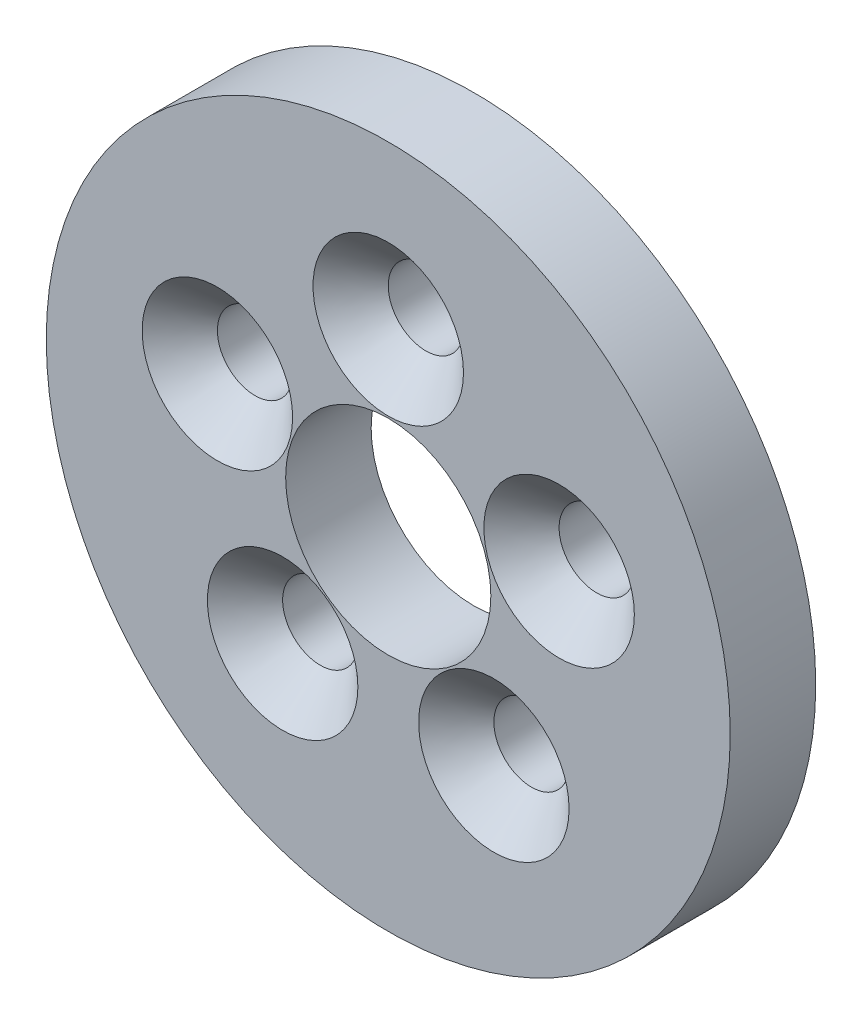
ISO-10303-21;
HEADER;
FILE_DESCRIPTION(('STEP AP214'),'2;1');
FILE_NAME('part.step','',(''),(''),'','','');
FILE_SCHEMA(('AUTOMOTIVE_DESIGN { 1 0 10303 214 1 1 1 1 }'));
ENDSEC;
DATA;
#1=APPLICATION_CONTEXT('core data for automotive mechanical design processes');
#2=APPLICATION_PROTOCOL_DEFINITION('international standard','automotive_design',2000,#1);
#3=PRODUCT_CONTEXT('',#1,'mechanical');
#4=PRODUCT('Part','Part','',(#3));
#5=PRODUCT_RELATED_PRODUCT_CATEGORY('part','',(#4));
#6=PRODUCT_DEFINITION_FORMATION('','',#4);
#7=PRODUCT_DEFINITION_CONTEXT('part definition',#1,'design');
#8=PRODUCT_DEFINITION('design','',#6,#7);
#9=PRODUCT_DEFINITION_SHAPE('','',#8);
#10=(LENGTH_UNIT() NAMED_UNIT(*) SI_UNIT(.MILLI.,.METRE.));
#11=(NAMED_UNIT(*) PLANE_ANGLE_UNIT() SI_UNIT($,.RADIAN.));
#12=(NAMED_UNIT(*) SI_UNIT($,.STERADIAN.) SOLID_ANGLE_UNIT());
#13=UNCERTAINTY_MEASURE_WITH_UNIT(LENGTH_MEASURE(1.E-05),#10,'distance_accuracy_value','');
#14=(GEOMETRIC_REPRESENTATION_CONTEXT(3) GLOBAL_UNCERTAINTY_ASSIGNED_CONTEXT((#13)) GLOBAL_UNIT_ASSIGNED_CONTEXT((#10,
#11,#12)) REPRESENTATION_CONTEXT('',''));
#15=CARTESIAN_POINT('',(0.,0.,0.));
#16=DIRECTION('',(0.,0.,1.));
#17=DIRECTION('',(1.,0.,0.));
#18=AXIS2_PLACEMENT_3D('',#15,#16,#17);
#19=CARTESIAN_POINT('',(0.,0.,2.5));
#20=DIRECTION('',(0.,0.,-1.));
#21=DIRECTION('',(-1.,0.,0.));
#22=AXIS2_PLACEMENT_3D('',#19,#20,#21);
#23=CYLINDRICAL_SURFACE('',#22,10.);
#24=CARTESIAN_POINT('',(0.,0.,2.5));
#25=DIRECTION('',(0.,0.,1.));
#26=DIRECTION('',(1.,0.,0.));
#27=AXIS2_PLACEMENT_3D('',#24,#25,#26);
#28=CIRCLE('',#27,10.);
#29=CARTESIAN_POINT('',(10.,0.,2.5));
#30=VERTEX_POINT('',#29);
#31=EDGE_CURVE('E44',#30,#30,#28,.T.);
#32=ORIENTED_EDGE('',*,*,#31,.F.);
#33=EDGE_LOOP('',(#32));
#34=FACE_BOUND('',#33,.T.);
#35=CARTESIAN_POINT('',(0.,0.,0.));
#36=DIRECTION('',(0.,0.,1.));
#37=DIRECTION('',(1.,0.,0.));
#38=AXIS2_PLACEMENT_3D('',#35,#36,#37);
#39=CIRCLE('',#38,10.);
#40=CARTESIAN_POINT('',(10.,0.,0.));
#41=VERTEX_POINT('',#40);
#42=EDGE_CURVE('E51',#41,#41,#39,.T.);
#43=ORIENTED_EDGE('',*,*,#42,.T.);
#44=EDGE_LOOP('',(#43));
#45=FACE_BOUND('',#44,.T.);
#46=ADVANCED_FACE('F37',(#34,#45),#23,.T.);
#47=CARTESIAN_POINT('',(0.,0.,2.5));
#48=DIRECTION('',(0.,0.,-1.));
#49=DIRECTION('',(-1.,0.,0.));
#50=AXIS2_PLACEMENT_3D('',#47,#48,#49);
#51=CYLINDRICAL_SURFACE('',#50,3.);
#52=CARTESIAN_POINT('',(0.,0.,2.5));
#53=DIRECTION('',(0.,0.,1.));
#54=DIRECTION('',(1.,0.,0.));
#55=AXIS2_PLACEMENT_3D('',#52,#53,#54);
#56=CIRCLE('',#55,3.);
#57=CARTESIAN_POINT('',(3.,0.,2.5));
#58=VERTEX_POINT('',#57);
#59=EDGE_CURVE('E10',#58,#58,#56,.T.);
#60=ORIENTED_EDGE('',*,*,#59,.T.);
#61=EDGE_LOOP('',(#60));
#62=FACE_BOUND('',#61,.T.);
#63=CARTESIAN_POINT('',(0.,0.,0.));
#64=DIRECTION('',(0.,0.,1.));
#65=DIRECTION('',(1.,0.,0.));
#66=AXIS2_PLACEMENT_3D('',#63,#64,#65);
#67=CIRCLE('',#66,3.);
#68=CARTESIAN_POINT('',(3.,0.,0.));
#69=VERTEX_POINT('',#68);
#70=EDGE_CURVE('E40',#69,#69,#67,.T.);
#71=ORIENTED_EDGE('',*,*,#70,.F.);
#72=EDGE_LOOP('',(#71));
#73=FACE_BOUND('',#72,.T.);
#74=ADVANCED_FACE('F110',(#62,#73),#51,.F.);
#75=CARTESIAN_POINT('',(0.,0.,2.5));
#76=DIRECTION('',(0.,0.,1.));
#77=DIRECTION('',(1.,0.,0.));
#78=AXIS2_PLACEMENT_3D('',#75,#76,#77);
#79=PLANE('',#78);
#80=CARTESIAN_POINT('',(0.,5.25328890437411,2.5));
#81=DIRECTION('',(0.,0.,1.));
#82=DIRECTION('',(1.,0.,0.));
#83=AXIS2_PLACEMENT_3D('',#80,#81,#82);
#84=CIRCLE('',#83,2.2);
#85=CARTESIAN_POINT('',(2.2,5.25328890437411,2.5));
#86=VERTEX_POINT('',#85);
#87=EDGE_CURVE('E100',#86,#86,#84,.T.);
#88=ORIENTED_EDGE('',*,*,#87,.F.);
#89=EDGE_LOOP('',(#88));
#90=FACE_BOUND('',#89,.T.);
#91=CARTESIAN_POINT('',(4.99617464448602,1.62335554781295,2.5));
#92=DIRECTION('',(0.,0.,1.));
#93=DIRECTION('',(1.,0.,0.));
#94=AXIS2_PLACEMENT_3D('',#91,#92,#93);
#95=CIRCLE('',#94,2.2);
#96=CARTESIAN_POINT('',(7.19617464448602,1.62335554781295,2.5));
#97=VERTEX_POINT('',#96);
#98=EDGE_CURVE('E91',#97,#97,#95,.T.);
#99=ORIENTED_EDGE('',*,*,#98,.F.);
#100=EDGE_LOOP('',(#99));
#101=FACE_BOUND('',#100,.T.);
#102=CARTESIAN_POINT('',(3.08780574402278,-4.25,2.5));
#103=DIRECTION('',(0.,0.,1.));
#104=DIRECTION('',(1.,0.,0.));
#105=AXIS2_PLACEMENT_3D('',#102,#103,#104);
#106=CIRCLE('',#105,2.2);
#107=CARTESIAN_POINT('',(5.28780574402278,-4.25,2.5));
#108=VERTEX_POINT('',#107);
#109=EDGE_CURVE('E82',#108,#108,#106,.T.);
#110=ORIENTED_EDGE('',*,*,#109,.F.);
#111=EDGE_LOOP('',(#110));
#112=FACE_BOUND('',#111,.T.);
#113=CARTESIAN_POINT('',(-4.99617464448602,1.62335554781295,2.5));
#114=DIRECTION('',(0.,0.,1.));
#115=DIRECTION('',(1.,0.,0.));
#116=AXIS2_PLACEMENT_3D('',#113,#114,#115);
#117=CIRCLE('',#116,2.2);
#118=CARTESIAN_POINT('',(-2.79617464448602,1.62335554781295,2.5));
#119=VERTEX_POINT('',#118);
#120=EDGE_CURVE('E73',#119,#119,#117,.T.);
#121=ORIENTED_EDGE('',*,*,#120,.F.);
#122=EDGE_LOOP('',(#121));
#123=FACE_BOUND('',#122,.T.);
#124=CARTESIAN_POINT('',(-3.08780574402278,-4.25,2.5));
#125=DIRECTION('',(0.,0.,1.));
#126=DIRECTION('',(1.,0.,0.));
#127=AXIS2_PLACEMENT_3D('',#124,#125,#126);
#128=CIRCLE('',#127,2.2);
#129=CARTESIAN_POINT('',(-0.887805744022783,-4.25,2.5));
#130=VERTEX_POINT('',#129);
#131=EDGE_CURVE('E62',#130,#130,#128,.T.);
#132=ORIENTED_EDGE('',*,*,#131,.F.);
#133=EDGE_LOOP('',(#132));
#134=FACE_BOUND('',#133,.T.);
#135=ORIENTED_EDGE('',*,*,#31,.T.);
#136=EDGE_LOOP('',(#135));
#137=FACE_BOUND('',#136,.T.);
#138=ORIENTED_EDGE('',*,*,#59,.F.);
#139=EDGE_LOOP('',(#138));
#140=FACE_BOUND('',#139,.T.);
#141=ADVANCED_FACE('F106',(#90,#101,#112,#123,#134,#137,#140),#79,.T.);
#142=CARTESIAN_POINT('',(0.,0.,0.));
#143=DIRECTION('',(0.,0.,1.));
#144=DIRECTION('',(1.,0.,0.));
#145=AXIS2_PLACEMENT_3D('',#142,#143,#144);
#146=PLANE('',#145);
#147=CARTESIAN_POINT('',(0.,5.25328890437411,0.));
#148=DIRECTION('',(0.,0.,1.));
#149=DIRECTION('',(1.,0.,0.));
#150=AXIS2_PLACEMENT_3D('',#147,#148,#149);
#151=CIRCLE('',#150,1.1);
#152=CARTESIAN_POINT('',(1.1,5.25328890437411,0.));
#153=VERTEX_POINT('',#152);
#154=EDGE_CURVE('E94',#153,#153,#151,.T.);
#155=ORIENTED_EDGE('',*,*,#154,.T.);
#156=EDGE_LOOP('',(#155));
#157=FACE_BOUND('',#156,.T.);
#158=CARTESIAN_POINT('',(4.99617464448602,1.62335554781295,0.));
#159=DIRECTION('',(0.,0.,1.));
#160=DIRECTION('',(1.,0.,0.));
#161=AXIS2_PLACEMENT_3D('',#158,#159,#160);
#162=CIRCLE('',#161,1.1);
#163=CARTESIAN_POINT('',(6.09617464448602,1.62335554781295,0.));
#164=VERTEX_POINT('',#163);
#165=EDGE_CURVE('E85',#164,#164,#162,.T.);
#166=ORIENTED_EDGE('',*,*,#165,.T.);
#167=EDGE_LOOP('',(#166));
#168=FACE_BOUND('',#167,.T.);
#169=CARTESIAN_POINT('',(3.08780574402278,-4.25,0.));
#170=DIRECTION('',(0.,0.,1.));
#171=DIRECTION('',(1.,0.,0.));
#172=AXIS2_PLACEMENT_3D('',#169,#170,#171);
#173=CIRCLE('',#172,1.1);
#174=CARTESIAN_POINT('',(4.18780574402278,-4.25,0.));
#175=VERTEX_POINT('',#174);
#176=EDGE_CURVE('E76',#175,#175,#173,.T.);
#177=ORIENTED_EDGE('',*,*,#176,.T.);
#178=EDGE_LOOP('',(#177));
#179=FACE_BOUND('',#178,.T.);
#180=CARTESIAN_POINT('',(-4.99617464448602,1.62335554781295,0.));
#181=DIRECTION('',(0.,0.,1.));
#182=DIRECTION('',(1.,0.,0.));
#183=AXIS2_PLACEMENT_3D('',#180,#181,#182);
#184=CIRCLE('',#183,1.1);
#185=CARTESIAN_POINT('',(-3.89617464448602,1.62335554781295,0.));
#186=VERTEX_POINT('',#185);
#187=EDGE_CURVE('E67',#186,#186,#184,.T.);
#188=ORIENTED_EDGE('',*,*,#187,.T.);
#189=EDGE_LOOP('',(#188));
#190=FACE_BOUND('',#189,.T.);
#191=CARTESIAN_POINT('',(-3.08780574402278,-4.25,0.));
#192=DIRECTION('',(0.,0.,1.));
#193=DIRECTION('',(1.,0.,0.));
#194=AXIS2_PLACEMENT_3D('',#191,#192,#193);
#195=CIRCLE('',#194,1.1);
#196=CARTESIAN_POINT('',(-1.98780574402278,-4.25,0.));
#197=VERTEX_POINT('',#196);
#198=EDGE_CURVE('E53',#197,#197,#195,.T.);
#199=ORIENTED_EDGE('',*,*,#198,.T.);
#200=EDGE_LOOP('',(#199));
#201=FACE_BOUND('',#200,.T.);
#202=ORIENTED_EDGE('',*,*,#42,.F.);
#203=EDGE_LOOP('',(#202));
#204=FACE_BOUND('',#203,.T.);
#205=ORIENTED_EDGE('',*,*,#70,.T.);
#206=EDGE_LOOP('',(#205));
#207=FACE_BOUND('',#206,.T.);
#208=ADVANCED_FACE('F109',(#157,#168,#179,#190,#201,#204,#207),#146,.F.);
#209=CARTESIAN_POINT('',(-3.08780574402278,-4.25,2.5));
#210=DIRECTION('',(0.,0.,1.));
#211=DIRECTION('',(1.,0.,0.));
#212=AXIS2_PLACEMENT_3D('',#209,#210,#211);
#213=CYLINDRICAL_SURFACE('',#212,1.1);
#214=ORIENTED_EDGE('',*,*,#198,.F.);
#215=EDGE_LOOP('',(#214));
#216=FACE_BOUND('',#215,.T.);
#217=CARTESIAN_POINT('',(-3.08780574402278,-4.25,1.4));
#218=DIRECTION('',(0.,0.,1.));
#219=DIRECTION('',(1.,0.,0.));
#220=AXIS2_PLACEMENT_3D('',#217,#218,#219);
#221=CIRCLE('',#220,1.1);
#222=CARTESIAN_POINT('',(-1.98780574402278,-4.25,1.4));
#223=VERTEX_POINT('',#222);
#224=EDGE_CURVE('E58',#223,#223,#221,.T.);
#225=ORIENTED_EDGE('',*,*,#224,.T.);
#226=EDGE_LOOP('',(#225));
#227=FACE_BOUND('',#226,.T.);
#228=ADVANCED_FACE('F132',(#216,#227),#213,.F.);
#229=CARTESIAN_POINT('',(-3.08780574402278,-4.25,2.5));
#230=DIRECTION('',(0.,0.,1.));
#231=DIRECTION('',(1.,0.,0.));
#232=AXIS2_PLACEMENT_3D('',#229,#230,#231);
#233=CONICAL_SURFACE('',#232,2.2,0.785398163397448);
#234=ORIENTED_EDGE('',*,*,#224,.F.);
#235=EDGE_LOOP('',(#234));
#236=FACE_BOUND('',#235,.T.);
#237=ORIENTED_EDGE('',*,*,#131,.T.);
#238=EDGE_LOOP('',(#237));
#239=FACE_BOUND('',#238,.T.);
#240=ADVANCED_FACE('F137',(#236,#239),#233,.F.);
#241=CARTESIAN_POINT('',(-4.99617464448602,1.62335554781295,2.5));
#242=DIRECTION('',(0.,0.,1.));
#243=DIRECTION('',(1.,0.,0.));
#244=AXIS2_PLACEMENT_3D('',#241,#242,#243);
#245=CYLINDRICAL_SURFACE('',#244,1.1);
#246=ORIENTED_EDGE('',*,*,#187,.F.);
#247=EDGE_LOOP('',(#246));
#248=FACE_BOUND('',#247,.T.);
#249=CARTESIAN_POINT('',(-4.99617464448602,1.62335554781295,1.4));
#250=DIRECTION('',(0.,0.,1.));
#251=DIRECTION('',(1.,0.,0.));
#252=AXIS2_PLACEMENT_3D('',#249,#250,#251);
#253=CIRCLE('',#252,1.1);
#254=CARTESIAN_POINT('',(-3.89617464448602,1.62335554781295,1.4));
#255=VERTEX_POINT('',#254);
#256=EDGE_CURVE('E70',#255,#255,#253,.T.);
#257=ORIENTED_EDGE('',*,*,#256,.T.);
#258=EDGE_LOOP('',(#257));
#259=FACE_BOUND('',#258,.T.);
#260=ADVANCED_FACE('F141',(#248,#259),#245,.F.);
#261=CARTESIAN_POINT('',(-4.99617464448602,1.62335554781295,2.5));
#262=DIRECTION('',(0.,0.,1.));
#263=DIRECTION('',(1.,0.,0.));
#264=AXIS2_PLACEMENT_3D('',#261,#262,#263);
#265=CONICAL_SURFACE('',#264,2.2,0.785398163397448);
#266=ORIENTED_EDGE('',*,*,#256,.F.);
#267=EDGE_LOOP('',(#266));
#268=FACE_BOUND('',#267,.T.);
#269=ORIENTED_EDGE('',*,*,#120,.T.);
#270=EDGE_LOOP('',(#269));
#271=FACE_BOUND('',#270,.T.);
#272=ADVANCED_FACE('F145',(#268,#271),#265,.F.);
#273=CARTESIAN_POINT('',(3.08780574402278,-4.25,2.5));
#274=DIRECTION('',(0.,0.,1.));
#275=DIRECTION('',(1.,0.,0.));
#276=AXIS2_PLACEMENT_3D('',#273,#274,#275);
#277=CYLINDRICAL_SURFACE('',#276,1.1);
#278=ORIENTED_EDGE('',*,*,#176,.F.);
#279=EDGE_LOOP('',(#278));
#280=FACE_BOUND('',#279,.T.);
#281=CARTESIAN_POINT('',(3.08780574402278,-4.25,1.4));
#282=DIRECTION('',(0.,0.,1.));
#283=DIRECTION('',(1.,0.,0.));
#284=AXIS2_PLACEMENT_3D('',#281,#282,#283);
#285=CIRCLE('',#284,1.1);
#286=CARTESIAN_POINT('',(4.18780574402278,-4.25,1.4));
#287=VERTEX_POINT('',#286);
#288=EDGE_CURVE('E79',#287,#287,#285,.T.);
#289=ORIENTED_EDGE('',*,*,#288,.T.);
#290=EDGE_LOOP('',(#289));
#291=FACE_BOUND('',#290,.T.);
#292=ADVANCED_FACE('F149',(#280,#291),#277,.F.);
#293=CARTESIAN_POINT('',(3.08780574402278,-4.25,2.5));
#294=DIRECTION('',(0.,0.,1.));
#295=DIRECTION('',(1.,0.,0.));
#296=AXIS2_PLACEMENT_3D('',#293,#294,#295);
#297=CONICAL_SURFACE('',#296,2.2,0.785398163397448);
#298=ORIENTED_EDGE('',*,*,#288,.F.);
#299=EDGE_LOOP('',(#298));
#300=FACE_BOUND('',#299,.T.);
#301=ORIENTED_EDGE('',*,*,#109,.T.);
#302=EDGE_LOOP('',(#301));
#303=FACE_BOUND('',#302,.T.);
#304=ADVANCED_FACE('F153',(#300,#303),#297,.F.);
#305=CARTESIAN_POINT('',(4.99617464448602,1.62335554781295,2.5));
#306=DIRECTION('',(0.,0.,1.));
#307=DIRECTION('',(1.,0.,0.));
#308=AXIS2_PLACEMENT_3D('',#305,#306,#307);
#309=CYLINDRICAL_SURFACE('',#308,1.1);
#310=ORIENTED_EDGE('',*,*,#165,.F.);
#311=EDGE_LOOP('',(#310));
#312=FACE_BOUND('',#311,.T.);
#313=CARTESIAN_POINT('',(4.99617464448602,1.62335554781295,1.4));
#314=DIRECTION('',(0.,0.,1.));
#315=DIRECTION('',(1.,0.,0.));
#316=AXIS2_PLACEMENT_3D('',#313,#314,#315);
#317=CIRCLE('',#316,1.1);
#318=CARTESIAN_POINT('',(6.09617464448602,1.62335554781295,1.4));
#319=VERTEX_POINT('',#318);
#320=EDGE_CURVE('E88',#319,#319,#317,.T.);
#321=ORIENTED_EDGE('',*,*,#320,.T.);
#322=EDGE_LOOP('',(#321));
#323=FACE_BOUND('',#322,.T.);
#324=ADVANCED_FACE('F157',(#312,#323),#309,.F.);
#325=CARTESIAN_POINT('',(4.99617464448602,1.62335554781295,2.5));
#326=DIRECTION('',(0.,0.,1.));
#327=DIRECTION('',(1.,0.,0.));
#328=AXIS2_PLACEMENT_3D('',#325,#326,#327);
#329=CONICAL_SURFACE('',#328,2.2,0.785398163397448);
#330=ORIENTED_EDGE('',*,*,#320,.F.);
#331=EDGE_LOOP('',(#330));
#332=FACE_BOUND('',#331,.T.);
#333=ORIENTED_EDGE('',*,*,#98,.T.);
#334=EDGE_LOOP('',(#333));
#335=FACE_BOUND('',#334,.T.);
#336=ADVANCED_FACE('F161',(#332,#335),#329,.F.);
#337=CARTESIAN_POINT('',(0.,5.25328890437411,2.5));
#338=DIRECTION('',(0.,0.,1.));
#339=DIRECTION('',(1.,0.,0.));
#340=AXIS2_PLACEMENT_3D('',#337,#338,#339);
#341=CYLINDRICAL_SURFACE('',#340,1.1);
#342=ORIENTED_EDGE('',*,*,#154,.F.);
#343=EDGE_LOOP('',(#342));
#344=FACE_BOUND('',#343,.T.);
#345=CARTESIAN_POINT('',(0.,5.25328890437411,1.4));
#346=DIRECTION('',(0.,0.,1.));
#347=DIRECTION('',(1.,0.,0.));
#348=AXIS2_PLACEMENT_3D('',#345,#346,#347);
#349=CIRCLE('',#348,1.1);
#350=CARTESIAN_POINT('',(1.1,5.25328890437411,1.4));
#351=VERTEX_POINT('',#350);
#352=EDGE_CURVE('E97',#351,#351,#349,.T.);
#353=ORIENTED_EDGE('',*,*,#352,.T.);
#354=EDGE_LOOP('',(#353));
#355=FACE_BOUND('',#354,.T.);
#356=ADVANCED_FACE('F165',(#344,#355),#341,.F.);
#357=CARTESIAN_POINT('',(0.,5.25328890437411,2.5));
#358=DIRECTION('',(0.,0.,1.));
#359=DIRECTION('',(1.,0.,0.));
#360=AXIS2_PLACEMENT_3D('',#357,#358,#359);
#361=CONICAL_SURFACE('',#360,2.2,0.785398163397448);
#362=ORIENTED_EDGE('',*,*,#352,.F.);
#363=EDGE_LOOP('',(#362));
#364=FACE_BOUND('',#363,.T.);
#365=ORIENTED_EDGE('',*,*,#87,.T.);
#366=EDGE_LOOP('',(#365));
#367=FACE_BOUND('',#366,.T.);
#368=ADVANCED_FACE('F104',(#364,#367),#361,.F.);
#369=CLOSED_SHELL('',(#46,#74,#141,#208,#228,#240,#260,#272,#292,#304,#324,#336,#356,#368));
#370=MANIFOLD_SOLID_BREP('B2',#369);
#371=ADVANCED_BREP_SHAPE_REPRESENTATION('',(#18,#370),#14);
#372=SHAPE_DEFINITION_REPRESENTATION(#9,#371);
ENDSEC;
END-ISO-10303-21;
